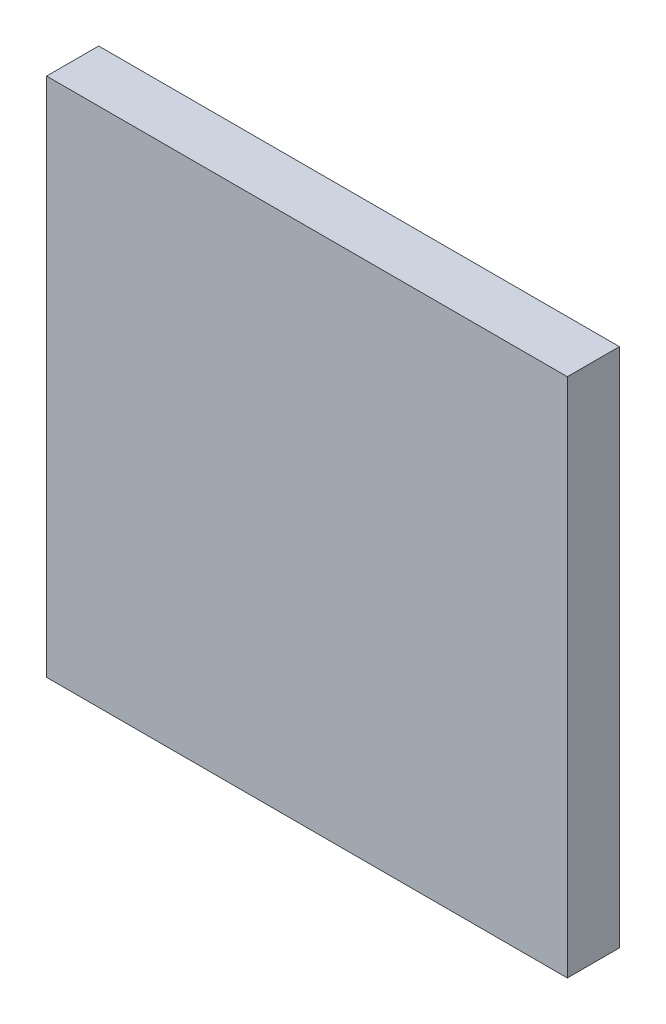
ISO-10303-21;
HEADER;
FILE_DESCRIPTION(('STEP AP214'),'2;1');
FILE_NAME('part.step','',(''),(''),'','','');
FILE_SCHEMA(('AUTOMOTIVE_DESIGN { 1 0 10303 214 1 1 1 1 }'));
ENDSEC;
DATA;
#1=APPLICATION_CONTEXT('core data for automotive mechanical design processes');
#2=APPLICATION_PROTOCOL_DEFINITION('international standard','automotive_design',2000,#1);
#3=PRODUCT_CONTEXT('',#1,'mechanical');
#4=PRODUCT('Part','Part','',(#3));
#5=PRODUCT_RELATED_PRODUCT_CATEGORY('part','',(#4));
#6=PRODUCT_DEFINITION_FORMATION('','',#4);
#7=PRODUCT_DEFINITION_CONTEXT('part definition',#1,'design');
#8=PRODUCT_DEFINITION('design','',#6,#7);
#9=PRODUCT_DEFINITION_SHAPE('','',#8);
#10=(LENGTH_UNIT() NAMED_UNIT(*) SI_UNIT(.MILLI.,.METRE.));
#11=(NAMED_UNIT(*) PLANE_ANGLE_UNIT() SI_UNIT($,.RADIAN.));
#12=(NAMED_UNIT(*) SI_UNIT($,.STERADIAN.) SOLID_ANGLE_UNIT());
#13=UNCERTAINTY_MEASURE_WITH_UNIT(LENGTH_MEASURE(1.E-05),#10,'distance_accuracy_value','');
#14=(GEOMETRIC_REPRESENTATION_CONTEXT(3) GLOBAL_UNCERTAINTY_ASSIGNED_CONTEXT((#13)) GLOBAL_UNIT_ASSIGNED_CONTEXT((#10,
#11,#12)) REPRESENTATION_CONTEXT('',''));
#15=CARTESIAN_POINT('',(0.,0.,0.));
#16=DIRECTION('',(0.,0.,1.));
#17=DIRECTION('',(1.,0.,0.));
#18=AXIS2_PLACEMENT_3D('',#15,#16,#17);
#19=CARTESIAN_POINT('',(-250.,250.,-50.));
#20=DIRECTION('',(-1.,0.,0.));
#21=DIRECTION('',(0.,-1.,0.));
#22=AXIS2_PLACEMENT_3D('',#19,#20,#21);
#23=PLANE('',#22);
#24=DIRECTION('',(0.,-1.,0.));
#25=VECTOR('',#24,1.);
#26=CARTESIAN_POINT('',(-250.,250.,0.));
#27=LINE('',#26,#25);
#28=CARTESIAN_POINT('',(-250.,250.,0.));
#29=VERTEX_POINT('',#28);
#30=CARTESIAN_POINT('',(-250.,-250.,0.));
#31=VERTEX_POINT('',#30);
#32=EDGE_CURVE('E100',#29,#31,#27,.T.);
#33=ORIENTED_EDGE('',*,*,#32,.F.);
#34=DIRECTION('',(0.,0.,1.));
#35=VECTOR('',#34,1.);
#36=CARTESIAN_POINT('',(-250.,250.,-50.));
#37=LINE('',#36,#35);
#38=CARTESIAN_POINT('',(-250.,250.,-50.));
#39=VERTEX_POINT('',#38);
#40=EDGE_CURVE('E11',#39,#29,#37,.T.);
#41=ORIENTED_EDGE('',*,*,#40,.F.);
#42=DIRECTION('',(0.,-1.,0.));
#43=VECTOR('',#42,1.);
#44=CARTESIAN_POINT('',(-250.,250.,-50.));
#45=LINE('',#44,#43);
#46=CARTESIAN_POINT('',(-250.,-250.,-50.));
#47=VERTEX_POINT('',#46);
#48=EDGE_CURVE('E95',#39,#47,#45,.T.);
#49=ORIENTED_EDGE('',*,*,#48,.T.);
#50=DIRECTION('',(0.,0.,1.));
#51=VECTOR('',#50,1.);
#52=CARTESIAN_POINT('',(-250.,-250.,-50.));
#53=LINE('',#52,#51);
#54=EDGE_CURVE('E38',#47,#31,#53,.T.);
#55=ORIENTED_EDGE('',*,*,#54,.T.);
#56=EDGE_LOOP('',(#33,#41,#49,#55));
#57=FACE_BOUND('',#56,.T.);
#58=ADVANCED_FACE('F35',(#57),#23,.T.);
#59=CARTESIAN_POINT('',(-250.,250.,-50.));
#60=DIRECTION('',(0.,-1.,0.));
#61=DIRECTION('',(0.,0.,-1.));
#62=AXIS2_PLACEMENT_3D('',#59,#60,#61);
#63=PLANE('',#62);
#64=DIRECTION('',(1.,0.,0.));
#65=VECTOR('',#64,1.);
#66=CARTESIAN_POINT('',(-250.,250.,0.));
#67=LINE('',#66,#65);
#68=CARTESIAN_POINT('',(250.,250.,0.));
#69=VERTEX_POINT('',#68);
#70=EDGE_CURVE('E68',#29,#69,#67,.T.);
#71=ORIENTED_EDGE('',*,*,#70,.T.);
#72=DIRECTION('',(0.,0.,1.));
#73=VECTOR('',#72,1.);
#74=CARTESIAN_POINT('',(250.,250.,-50.));
#75=LINE('',#74,#73);
#76=CARTESIAN_POINT('',(250.,250.,-50.));
#77=VERTEX_POINT('',#76);
#78=EDGE_CURVE('E44',#77,#69,#75,.T.);
#79=ORIENTED_EDGE('',*,*,#78,.F.);
#80=DIRECTION('',(1.,0.,0.));
#81=VECTOR('',#80,1.);
#82=CARTESIAN_POINT('',(-250.,250.,-50.));
#83=LINE('',#82,#81);
#84=EDGE_CURVE('E85',#39,#77,#83,.T.);
#85=ORIENTED_EDGE('',*,*,#84,.F.);
#86=ORIENTED_EDGE('',*,*,#40,.T.);
#87=EDGE_LOOP('',(#71,#79,#85,#86));
#88=FACE_BOUND('',#87,.T.);
#89=ADVANCED_FACE('F110',(#88),#63,.F.);
#90=CARTESIAN_POINT('',(250.,250.,-50.));
#91=DIRECTION('',(-1.,0.,0.));
#92=DIRECTION('',(0.,-1.,0.));
#93=AXIS2_PLACEMENT_3D('',#90,#91,#92);
#94=PLANE('',#93);
#95=DIRECTION('',(0.,-1.,0.));
#96=VECTOR('',#95,1.);
#97=CARTESIAN_POINT('',(250.,250.,0.));
#98=LINE('',#97,#96);
#99=CARTESIAN_POINT('',(250.,-250.,0.));
#100=VERTEX_POINT('',#99);
#101=EDGE_CURVE('E92',#69,#100,#98,.T.);
#102=ORIENTED_EDGE('',*,*,#101,.T.);
#103=DIRECTION('',(0.,0.,1.));
#104=VECTOR('',#103,1.);
#105=CARTESIAN_POINT('',(250.,-250.,-50.));
#106=LINE('',#105,#104);
#107=CARTESIAN_POINT('',(250.,-250.,-50.));
#108=VERTEX_POINT('',#107);
#109=EDGE_CURVE('E89',#108,#100,#106,.T.);
#110=ORIENTED_EDGE('',*,*,#109,.F.);
#111=DIRECTION('',(0.,-1.,0.));
#112=VECTOR('',#111,1.);
#113=CARTESIAN_POINT('',(250.,250.,-50.));
#114=LINE('',#113,#112);
#115=EDGE_CURVE('E80',#77,#108,#114,.T.);
#116=ORIENTED_EDGE('',*,*,#115,.F.);
#117=ORIENTED_EDGE('',*,*,#78,.T.);
#118=EDGE_LOOP('',(#102,#110,#116,#117));
#119=FACE_BOUND('',#118,.T.);
#120=ADVANCED_FACE('F90',(#119),#94,.F.);
#121=CARTESIAN_POINT('',(-250.,-250.,-50.));
#122=DIRECTION('',(0.,-1.,0.));
#123=DIRECTION('',(0.,0.,-1.));
#124=AXIS2_PLACEMENT_3D('',#121,#122,#123);
#125=PLANE('',#124);
#126=DIRECTION('',(1.,0.,0.));
#127=VECTOR('',#126,1.);
#128=CARTESIAN_POINT('',(-250.,-250.,0.));
#129=LINE('',#128,#127);
#130=EDGE_CURVE('E103',#31,#100,#129,.T.);
#131=ORIENTED_EDGE('',*,*,#130,.F.);
#132=ORIENTED_EDGE('',*,*,#54,.F.);
#133=DIRECTION('',(1.,0.,0.));
#134=VECTOR('',#133,1.);
#135=CARTESIAN_POINT('',(-250.,-250.,-50.));
#136=LINE('',#135,#134);
#137=EDGE_CURVE('E84',#47,#108,#136,.T.);
#138=ORIENTED_EDGE('',*,*,#137,.T.);
#139=ORIENTED_EDGE('',*,*,#109,.T.);
#140=EDGE_LOOP('',(#131,#132,#138,#139));
#141=FACE_BOUND('',#140,.T.);
#142=ADVANCED_FACE('F94',(#141),#125,.T.);
#143=CARTESIAN_POINT('',(0.,0.,-50.));
#144=DIRECTION('',(0.,0.,1.));
#145=DIRECTION('',(1.,0.,0.));
#146=AXIS2_PLACEMENT_3D('',#143,#144,#145);
#147=PLANE('',#146);
#148=ORIENTED_EDGE('',*,*,#48,.F.);
#149=ORIENTED_EDGE('',*,*,#84,.T.);
#150=ORIENTED_EDGE('',*,*,#115,.T.);
#151=ORIENTED_EDGE('',*,*,#137,.F.);
#152=EDGE_LOOP('',(#148,#149,#150,#151));
#153=FACE_BOUND('',#152,.T.);
#154=ADVANCED_FACE('F83',(#153),#147,.F.);
#155=CARTESIAN_POINT('',(0.,0.,0.));
#156=DIRECTION('',(0.,0.,1.));
#157=DIRECTION('',(1.,0.,0.));
#158=AXIS2_PLACEMENT_3D('',#155,#156,#157);
#159=PLANE('',#158);
#160=ORIENTED_EDGE('',*,*,#32,.T.);
#161=ORIENTED_EDGE('',*,*,#130,.T.);
#162=ORIENTED_EDGE('',*,*,#101,.F.);
#163=ORIENTED_EDGE('',*,*,#70,.F.);
#164=EDGE_LOOP('',(#160,#161,#162,#163));
#165=FACE_BOUND('',#164,.T.);
#166=ADVANCED_FACE('F108',(#165),#159,.T.);
#167=CLOSED_SHELL('',(#58,#89,#120,#142,#154,#166));
#168=MANIFOLD_SOLID_BREP('B2',#167);
#169=ADVANCED_BREP_SHAPE_REPRESENTATION('',(#18,#168),#14);
#170=SHAPE_DEFINITION_REPRESENTATION(#9,#169);
ENDSEC;
END-ISO-10303-21;
